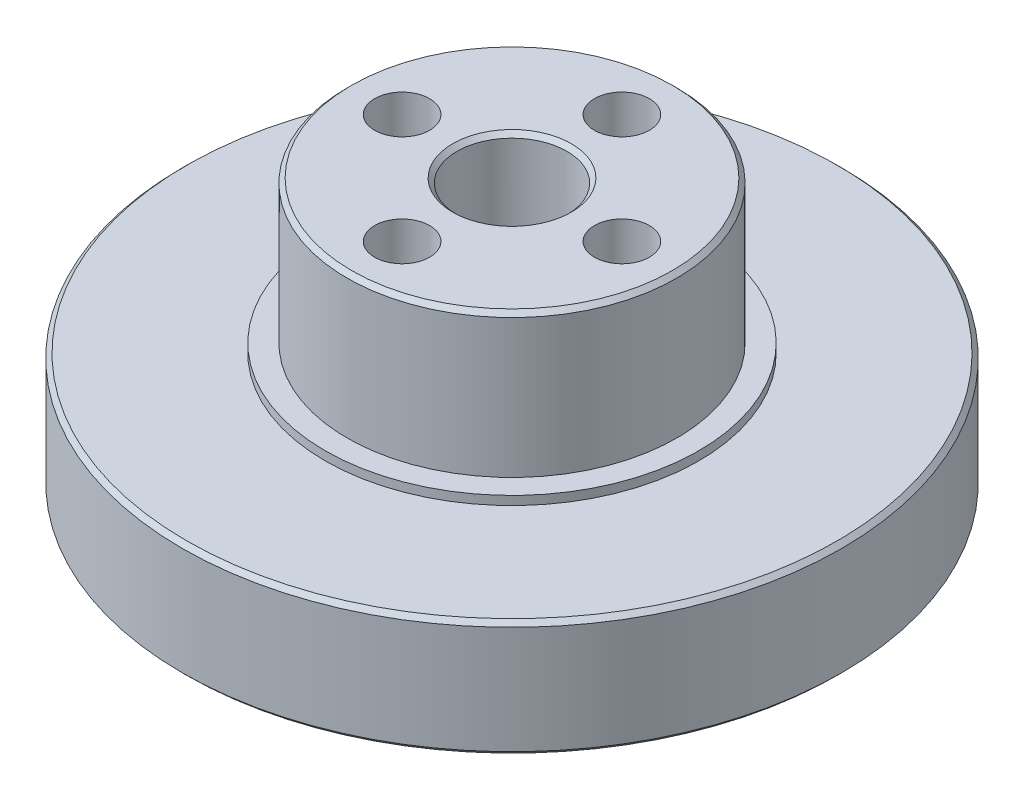
ISO-10303-21;
HEADER;
FILE_DESCRIPTION(('STEP AP214'),'2;1');
FILE_NAME('part.step','',(''),(''),'','','');
FILE_SCHEMA(('AUTOMOTIVE_DESIGN { 1 0 10303 214 1 1 1 1 }'));
ENDSEC;
DATA;
#1=APPLICATION_CONTEXT('core data for automotive mechanical design processes');
#2=APPLICATION_PROTOCOL_DEFINITION('international standard','automotive_design',2000,#1);
#3=PRODUCT_CONTEXT('',#1,'mechanical');
#4=PRODUCT('Part','Part','',(#3));
#5=PRODUCT_RELATED_PRODUCT_CATEGORY('part','',(#4));
#6=PRODUCT_DEFINITION_FORMATION('','',#4);
#7=PRODUCT_DEFINITION_CONTEXT('part definition',#1,'design');
#8=PRODUCT_DEFINITION('design','',#6,#7);
#9=PRODUCT_DEFINITION_SHAPE('','',#8);
#10=(LENGTH_UNIT() NAMED_UNIT(*) SI_UNIT(.MILLI.,.METRE.));
#11=(NAMED_UNIT(*) PLANE_ANGLE_UNIT() SI_UNIT($,.RADIAN.));
#12=(NAMED_UNIT(*) SI_UNIT($,.STERADIAN.) SOLID_ANGLE_UNIT());
#13=UNCERTAINTY_MEASURE_WITH_UNIT(LENGTH_MEASURE(1.E-05),#10,'distance_accuracy_value','');
#14=(GEOMETRIC_REPRESENTATION_CONTEXT(3) GLOBAL_UNCERTAINTY_ASSIGNED_CONTEXT((#13)) GLOBAL_UNIT_ASSIGNED_CONTEXT((#10,
#11,#12)) REPRESENTATION_CONTEXT('',''));
#15=CARTESIAN_POINT('',(0.,0.,0.));
#16=DIRECTION('',(0.,0.,1.));
#17=DIRECTION('',(1.,0.,0.));
#18=AXIS2_PLACEMENT_3D('',#15,#16,#17);
#19=CARTESIAN_POINT('',(0.,5.2,0.));
#20=DIRECTION('',(0.,1.,0.));
#21=DIRECTION('',(0.,0.,1.));
#22=AXIS2_PLACEMENT_3D('',#19,#20,#21);
#23=CYLINDRICAL_SURFACE('',#22,2.5);
#24=CARTESIAN_POINT('',(0.,2.5,0.));
#25=DIRECTION('',(0.,-1.,0.));
#26=DIRECTION('',(0.,0.,-1.));
#27=AXIS2_PLACEMENT_3D('',#24,#25,#26);
#28=CIRCLE('',#27,2.5);
#29=CARTESIAN_POINT('',(0.,2.5,-2.5));
#30=VERTEX_POINT('',#29);
#31=EDGE_CURVE('E10',#30,#30,#28,.T.);
#32=ORIENTED_EDGE('',*,*,#31,.T.);
#33=EDGE_LOOP('',(#32));
#34=FACE_BOUND('',#33,.T.);
#35=CARTESIAN_POINT('',(0.,12.,0.));
#36=DIRECTION('',(0.,1.,0.));
#37=DIRECTION('',(0.,0.,1.));
#38=AXIS2_PLACEMENT_3D('',#35,#36,#37);
#39=CIRCLE('',#38,2.5);
#40=CARTESIAN_POINT('',(0.,12.,2.5));
#41=VERTEX_POINT('',#40);
#42=EDGE_CURVE('E74',#41,#41,#39,.T.);
#43=ORIENTED_EDGE('',*,*,#42,.T.);
#44=EDGE_LOOP('',(#43));
#45=FACE_BOUND('',#44,.T.);
#46=ADVANCED_FACE('F35',(#34,#45),#23,.F.);
#47=CARTESIAN_POINT('',(0.,0.,0.));
#48=DIRECTION('',(0.,1.,0.));
#49=DIRECTION('',(0.,0.,1.));
#50=AXIS2_PLACEMENT_3D('',#47,#48,#49);
#51=PLANE('',#50);
#52=CARTESIAN_POINT('',(0.,0.,0.));
#53=DIRECTION('',(0.,1.,0.));
#54=DIRECTION('',(0.,0.,1.));
#55=AXIS2_PLACEMENT_3D('',#52,#53,#54);
#56=CIRCLE('',#55,6.5);
#57=CARTESIAN_POINT('',(0.,0.,6.5));
#58=VERTEX_POINT('',#57);
#59=EDGE_CURVE('E51',#58,#58,#56,.T.);
#60=ORIENTED_EDGE('',*,*,#59,.T.);
#61=EDGE_LOOP('',(#60));
#62=FACE_BOUND('',#61,.T.);
#63=CARTESIAN_POINT('',(-9.98094277861542,0.,-5.76249999999957));
#64=DIRECTION('',(0.,1.,0.));
#65=DIRECTION('',(0.,0.,1.));
#66=AXIS2_PLACEMENT_3D('',#63,#64,#65);
#67=CIRCLE('',#66,2.06);
#68=CARTESIAN_POINT('',(-9.98094277861542,0.,-7.82249999999957));
#69=VERTEX_POINT('',#68);
#70=EDGE_CURVE('E101',#69,#69,#67,.T.);
#71=ORIENTED_EDGE('',*,*,#70,.T.);
#72=EDGE_LOOP('',(#71));
#73=FACE_BOUND('',#72,.T.);
#74=CARTESIAN_POINT('',(-9.98094277861492,0.,5.76250000000043));
#75=DIRECTION('',(0.,1.,0.));
#76=DIRECTION('',(0.,0.,1.));
#77=AXIS2_PLACEMENT_3D('',#74,#75,#76);
#78=CIRCLE('',#77,2.06);
#79=CARTESIAN_POINT('',(-9.98094277861492,0.,7.82250000000043));
#80=VERTEX_POINT('',#79);
#81=EDGE_CURVE('E104',#80,#80,#78,.T.);
#82=ORIENTED_EDGE('',*,*,#81,.T.);
#83=EDGE_LOOP('',(#82));
#84=FACE_BOUND('',#83,.T.);
#85=CARTESIAN_POINT('',(9.78446387248167E-13,0.,11.525));
#86=DIRECTION('',(0.,1.,0.));
#87=DIRECTION('',(0.,0.,1.));
#88=AXIS2_PLACEMENT_3D('',#85,#86,#87);
#89=CIRCLE('',#88,2.06);
#90=CARTESIAN_POINT('',(9.78446387248167E-13,0.,13.585));
#91=VERTEX_POINT('',#90);
#92=EDGE_CURVE('E107',#91,#91,#89,.T.);
#93=ORIENTED_EDGE('',*,*,#92,.T.);
#94=EDGE_LOOP('',(#93));
#95=FACE_BOUND('',#94,.T.);
#96=CARTESIAN_POINT('',(9.98094277861639,0.,5.76249999999958));
#97=DIRECTION('',(0.,1.,0.));
#98=DIRECTION('',(0.,0.,1.));
#99=AXIS2_PLACEMENT_3D('',#96,#97,#98);
#100=CIRCLE('',#99,2.06);
#101=CARTESIAN_POINT('',(9.98094277861639,0.,7.82249999999957));
#102=VERTEX_POINT('',#101);
#103=EDGE_CURVE('E110',#102,#102,#100,.T.);
#104=ORIENTED_EDGE('',*,*,#103,.T.);
#105=EDGE_LOOP('',(#104));
#106=FACE_BOUND('',#105,.T.);
#107=CARTESIAN_POINT('',(9.9809427786159,0.,-5.76250000000043));
#108=DIRECTION('',(0.,1.,0.));
#109=DIRECTION('',(0.,0.,1.));
#110=AXIS2_PLACEMENT_3D('',#107,#108,#109);
#111=CIRCLE('',#110,2.06);
#112=CARTESIAN_POINT('',(9.9809427786159,0.,-3.70250000000043));
#113=VERTEX_POINT('',#112);
#114=EDGE_CURVE('E113',#113,#113,#111,.T.);
#115=ORIENTED_EDGE('',*,*,#114,.T.);
#116=EDGE_LOOP('',(#115));
#117=FACE_BOUND('',#116,.T.);
#118=CARTESIAN_POINT('',(0.,0.,-11.525));
#119=DIRECTION('',(0.,1.,0.));
#120=DIRECTION('',(0.,0.,1.));
#121=AXIS2_PLACEMENT_3D('',#118,#119,#120);
#122=CIRCLE('',#121,2.06);
#123=CARTESIAN_POINT('',(0.,0.,-9.46500000000001));
#124=VERTEX_POINT('',#123);
#125=EDGE_CURVE('E116',#124,#124,#122,.T.);
#126=ORIENTED_EDGE('',*,*,#125,.T.);
#127=EDGE_LOOP('',(#126));
#128=FACE_BOUND('',#127,.T.);
#129=CARTESIAN_POINT('',(0.,0.,0.));
#130=DIRECTION('',(0.,1.,0.));
#131=DIRECTION('',(0.,0.,1.));
#132=AXIS2_PLACEMENT_3D('',#129,#130,#131);
#133=CIRCLE('',#132,14.8);
#134=CARTESIAN_POINT('',(0.,0.,14.8));
#135=VERTEX_POINT('',#134);
#136=EDGE_CURVE('E119',#135,#135,#133,.F.);
#137=ORIENTED_EDGE('',*,*,#136,.T.);
#138=EDGE_LOOP('',(#137));
#139=FACE_BOUND('',#138,.T.);
#140=ADVANCED_FACE('F208',(#62,#73,#84,#95,#106,#117,#128,#139),#51,.F.);
#141=CARTESIAN_POINT('',(0.,3.7,0.));
#142=DIRECTION('',(0.,-1.,0.));
#143=DIRECTION('',(0.,0.,-1.));
#144=AXIS2_PLACEMENT_3D('',#141,#142,#143);
#145=CYLINDRICAL_SURFACE('',#144,15.);
#146=CARTESIAN_POINT('',(0.,0.200000000000004,0.));
#147=DIRECTION('',(0.,1.,0.));
#148=DIRECTION('',(0.,0.,1.));
#149=AXIS2_PLACEMENT_3D('',#146,#147,#148);
#150=CIRCLE('',#149,15.);
#151=CARTESIAN_POINT('',(0.,0.200000000000004,15.));
#152=VERTEX_POINT('',#151);
#153=EDGE_CURVE('E77',#152,#152,#150,.T.);
#154=ORIENTED_EDGE('',*,*,#153,.T.);
#155=EDGE_LOOP('',(#154));
#156=FACE_BOUND('',#155,.T.);
#157=CARTESIAN_POINT('',(0.,5.1,0.));
#158=DIRECTION('',(0.,1.,0.));
#159=DIRECTION('',(0.,0.,1.));
#160=AXIS2_PLACEMENT_3D('',#157,#158,#159);
#161=CIRCLE('',#160,15.);
#162=CARTESIAN_POINT('',(0.,5.1,15.));
#163=VERTEX_POINT('',#162);
#164=EDGE_CURVE('E80',#163,#163,#161,.F.);
#165=ORIENTED_EDGE('',*,*,#164,.T.);
#166=EDGE_LOOP('',(#165));
#167=FACE_BOUND('',#166,.T.);
#168=ADVANCED_FACE('F213',(#156,#167),#145,.T.);
#169=CARTESIAN_POINT('',(0.,3.7,-11.525));
#170=DIRECTION('',(0.,-1.,0.));
#171=DIRECTION('',(0.,0.,-1.));
#172=AXIS2_PLACEMENT_3D('',#169,#170,#171);
#173=CYLINDRICAL_SURFACE('',#172,1.86);
#174=CARTESIAN_POINT('',(0.,0.199999999999991,-11.525));
#175=DIRECTION('',(0.,1.,0.));
#176=DIRECTION('',(0.,0.,1.));
#177=AXIS2_PLACEMENT_3D('',#174,#175,#176);
#178=CIRCLE('',#177,1.86);
#179=CARTESIAN_POINT('',(0.,0.199999999999991,-9.665));
#180=VERTEX_POINT('',#179);
#181=EDGE_CURVE('E83',#180,#180,#178,.F.);
#182=ORIENTED_EDGE('',*,*,#181,.T.);
#183=EDGE_LOOP('',(#182));
#184=FACE_BOUND('',#183,.T.);
#185=CARTESIAN_POINT('',(0.,3.7,-11.525));
#186=DIRECTION('',(0.,1.,0.));
#187=DIRECTION('',(0.,0.,1.));
#188=AXIS2_PLACEMENT_3D('',#185,#186,#187);
#189=CIRCLE('',#188,1.86);
#190=CARTESIAN_POINT('',(0.,3.7,-9.665));
#191=VERTEX_POINT('',#190);
#192=EDGE_CURVE('E123',#191,#191,#189,.T.);
#193=ORIENTED_EDGE('',*,*,#192,.T.);
#194=EDGE_LOOP('',(#193));
#195=FACE_BOUND('',#194,.T.);
#196=ADVANCED_FACE('F339',(#184,#195),#173,.F.);
#197=CARTESIAN_POINT('',(9.9809427786159,3.7,-5.76250000000043));
#198=DIRECTION('',(0.,-1.,0.));
#199=DIRECTION('',(0.,0.,-1.));
#200=AXIS2_PLACEMENT_3D('',#197,#198,#199);
#201=CYLINDRICAL_SURFACE('',#200,1.86);
#202=CARTESIAN_POINT('',(9.9809427786159,0.199999999999999,-5.76250000000043));
#203=DIRECTION('',(0.,1.,0.));
#204=DIRECTION('',(0.,0.,1.));
#205=AXIS2_PLACEMENT_3D('',#202,#203,#204);
#206=CIRCLE('',#205,1.86);
#207=CARTESIAN_POINT('',(9.9809427786159,0.199999999999999,-3.90250000000043));
#208=VERTEX_POINT('',#207);
#209=EDGE_CURVE('E86',#208,#208,#206,.F.);
#210=ORIENTED_EDGE('',*,*,#209,.T.);
#211=EDGE_LOOP('',(#210));
#212=FACE_BOUND('',#211,.T.);
#213=CARTESIAN_POINT('',(9.9809427786159,3.7,-5.76250000000043));
#214=DIRECTION('',(0.,1.,0.));
#215=DIRECTION('',(0.,0.,1.));
#216=AXIS2_PLACEMENT_3D('',#213,#214,#215);
#217=CIRCLE('',#216,1.86);
#218=CARTESIAN_POINT('',(9.9809427786159,3.7,-3.90250000000043));
#219=VERTEX_POINT('',#218);
#220=EDGE_CURVE('E127',#219,#219,#217,.T.);
#221=ORIENTED_EDGE('',*,*,#220,.T.);
#222=EDGE_LOOP('',(#221));
#223=FACE_BOUND('',#222,.T.);
#224=ADVANCED_FACE('F344',(#212,#223),#201,.F.);
#225=CARTESIAN_POINT('',(9.98094277861639,3.7,5.76249999999958));
#226=DIRECTION('',(0.,-1.,0.));
#227=DIRECTION('',(0.,0.,-1.));
#228=AXIS2_PLACEMENT_3D('',#225,#226,#227);
#229=CYLINDRICAL_SURFACE('',#228,1.86);
#230=CARTESIAN_POINT('',(9.98094277861639,0.199999999999999,5.76249999999958));
#231=DIRECTION('',(0.,1.,0.));
#232=DIRECTION('',(0.,0.,1.));
#233=AXIS2_PLACEMENT_3D('',#230,#231,#232);
#234=CIRCLE('',#233,1.86);
#235=CARTESIAN_POINT('',(9.98094277861639,0.199999999999999,7.62249999999958));
#236=VERTEX_POINT('',#235);
#237=EDGE_CURVE('E89',#236,#236,#234,.F.);
#238=ORIENTED_EDGE('',*,*,#237,.T.);
#239=EDGE_LOOP('',(#238));
#240=FACE_BOUND('',#239,.T.);
#241=CARTESIAN_POINT('',(9.98094277861639,3.7,5.76249999999958));
#242=DIRECTION('',(0.,1.,0.));
#243=DIRECTION('',(0.,0.,1.));
#244=AXIS2_PLACEMENT_3D('',#241,#242,#243);
#245=CIRCLE('',#244,1.86);
#246=CARTESIAN_POINT('',(9.98094277861639,3.7,7.62249999999958));
#247=VERTEX_POINT('',#246);
#248=EDGE_CURVE('E126',#247,#247,#245,.T.);
#249=ORIENTED_EDGE('',*,*,#248,.T.);
#250=EDGE_LOOP('',(#249));
#251=FACE_BOUND('',#250,.T.);
#252=ADVANCED_FACE('F348',(#240,#251),#229,.F.);
#253=CARTESIAN_POINT('',(9.78446387248167E-13,3.7,11.525));
#254=DIRECTION('',(0.,-1.,0.));
#255=DIRECTION('',(0.,0.,-1.));
#256=AXIS2_PLACEMENT_3D('',#253,#254,#255);
#257=CYLINDRICAL_SURFACE('',#256,1.86);
#258=CARTESIAN_POINT('',(9.78446387248167E-13,0.199999999999991,11.525));
#259=DIRECTION('',(0.,1.,0.));
#260=DIRECTION('',(0.,0.,1.));
#261=AXIS2_PLACEMENT_3D('',#258,#259,#260);
#262=CIRCLE('',#261,1.86);
#263=CARTESIAN_POINT('',(9.78446387248167E-13,0.199999999999991,13.385));
#264=VERTEX_POINT('',#263);
#265=EDGE_CURVE('E92',#264,#264,#262,.F.);
#266=ORIENTED_EDGE('',*,*,#265,.T.);
#267=EDGE_LOOP('',(#266));
#268=FACE_BOUND('',#267,.T.);
#269=CARTESIAN_POINT('',(9.78446387248167E-13,3.7,11.525));
#270=DIRECTION('',(0.,1.,0.));
#271=DIRECTION('',(0.,0.,1.));
#272=AXIS2_PLACEMENT_3D('',#269,#270,#271);
#273=CIRCLE('',#272,1.86);
#274=CARTESIAN_POINT('',(9.78446387248167E-13,3.7,13.385));
#275=VERTEX_POINT('',#274);
#276=EDGE_CURVE('E130',#275,#275,#273,.T.);
#277=ORIENTED_EDGE('',*,*,#276,.T.);
#278=EDGE_LOOP('',(#277));
#279=FACE_BOUND('',#278,.T.);
#280=ADVANCED_FACE('F352',(#268,#279),#257,.F.);
#281=CARTESIAN_POINT('',(-9.98094277861492,3.7,5.76250000000043));
#282=DIRECTION('',(0.,-1.,0.));
#283=DIRECTION('',(0.,0.,-1.));
#284=AXIS2_PLACEMENT_3D('',#281,#282,#283);
#285=CYLINDRICAL_SURFACE('',#284,1.86);
#286=CARTESIAN_POINT('',(-9.98094277861492,0.199999999999999,5.76250000000043));
#287=DIRECTION('',(0.,1.,0.));
#288=DIRECTION('',(0.,0.,1.));
#289=AXIS2_PLACEMENT_3D('',#286,#287,#288);
#290=CIRCLE('',#289,1.86);
#291=CARTESIAN_POINT('',(-9.98094277861492,0.199999999999999,7.62250000000043));
#292=VERTEX_POINT('',#291);
#293=EDGE_CURVE('E95',#292,#292,#290,.F.);
#294=ORIENTED_EDGE('',*,*,#293,.T.);
#295=EDGE_LOOP('',(#294));
#296=FACE_BOUND('',#295,.T.);
#297=CARTESIAN_POINT('',(-9.98094277861492,3.7,5.76250000000043));
#298=DIRECTION('',(0.,1.,0.));
#299=DIRECTION('',(0.,0.,1.));
#300=AXIS2_PLACEMENT_3D('',#297,#298,#299);
#301=CIRCLE('',#300,1.86);
#302=CARTESIAN_POINT('',(-9.98094277861492,3.7,7.62250000000043));
#303=VERTEX_POINT('',#302);
#304=EDGE_CURVE('E133',#303,#303,#301,.T.);
#305=ORIENTED_EDGE('',*,*,#304,.T.);
#306=EDGE_LOOP('',(#305));
#307=FACE_BOUND('',#306,.T.);
#308=ADVANCED_FACE('F356',(#296,#307),#285,.F.);
#309=CARTESIAN_POINT('',(-9.98094277861542,3.7,-5.76249999999957));
#310=DIRECTION('',(0.,-1.,0.));
#311=DIRECTION('',(0.,0.,-1.));
#312=AXIS2_PLACEMENT_3D('',#309,#310,#311);
#313=CYLINDRICAL_SURFACE('',#312,1.86);
#314=CARTESIAN_POINT('',(-9.98094277861542,0.2,-5.76249999999957));
#315=DIRECTION('',(0.,1.,0.));
#316=DIRECTION('',(0.,0.,1.));
#317=AXIS2_PLACEMENT_3D('',#314,#315,#316);
#318=CIRCLE('',#317,1.86);
#319=CARTESIAN_POINT('',(-9.98094277861542,0.2,-7.62249999999957));
#320=VERTEX_POINT('',#319);
#321=EDGE_CURVE('E98',#320,#320,#318,.F.);
#322=ORIENTED_EDGE('',*,*,#321,.T.);
#323=EDGE_LOOP('',(#322));
#324=FACE_BOUND('',#323,.T.);
#325=CARTESIAN_POINT('',(-9.98094277861542,3.7,-5.76249999999957));
#326=DIRECTION('',(0.,1.,0.));
#327=DIRECTION('',(0.,0.,1.));
#328=AXIS2_PLACEMENT_3D('',#325,#326,#327);
#329=CIRCLE('',#328,1.86);
#330=CARTESIAN_POINT('',(-9.98094277861542,3.7,-3.90249999999957));
#331=VERTEX_POINT('',#330);
#332=EDGE_CURVE('E136',#331,#331,#329,.T.);
#333=ORIENTED_EDGE('',*,*,#332,.T.);
#334=EDGE_LOOP('',(#333));
#335=FACE_BOUND('',#334,.T.);
#336=ADVANCED_FACE('F360',(#324,#335),#313,.F.);
#337=CARTESIAN_POINT('',(0.,3.7,0.));
#338=DIRECTION('',(0.,1.,0.));
#339=DIRECTION('',(0.,0.,1.));
#340=AXIS2_PLACEMENT_3D('',#337,#338,#339);
#341=PLANE('',#340);
#342=ORIENTED_EDGE('',*,*,#332,.F.);
#343=EDGE_LOOP('',(#342));
#344=FACE_BOUND('',#343,.T.);
#345=ADVANCED_FACE('F364',(#344),#341,.F.);
#346=ORIENTED_EDGE('',*,*,#276,.F.);
#347=EDGE_LOOP('',(#346));
#348=FACE_BOUND('',#347,.T.);
#349=ADVANCED_FACE('F540',(#348),#341,.F.);
#350=ORIENTED_EDGE('',*,*,#220,.F.);
#351=EDGE_LOOP('',(#350));
#352=FACE_BOUND('',#351,.T.);
#353=ADVANCED_FACE('F547',(#352),#341,.F.);
#354=ORIENTED_EDGE('',*,*,#192,.F.);
#355=EDGE_LOOP('',(#354));
#356=FACE_BOUND('',#355,.T.);
#357=ADVANCED_FACE('F554',(#356),#341,.F.);
#358=ORIENTED_EDGE('',*,*,#248,.F.);
#359=EDGE_LOOP('',(#358));
#360=FACE_BOUND('',#359,.T.);
#361=ADVANCED_FACE('F370',(#360),#341,.F.);
#362=ORIENTED_EDGE('',*,*,#304,.F.);
#363=EDGE_LOOP('',(#362));
#364=FACE_BOUND('',#363,.T.);
#365=ADVANCED_FACE('F366',(#364),#341,.F.);
#366=CARTESIAN_POINT('',(0.,5.3,0.));
#367=DIRECTION('',(0.,1.,0.));
#368=DIRECTION('',(0.,0.,1.));
#369=AXIS2_PLACEMENT_3D('',#366,#367,#368);
#370=PLANE('',#369);
#371=CARTESIAN_POINT('',(0.,5.3,0.));
#372=DIRECTION('',(0.,1.,0.));
#373=DIRECTION('',(0.,0.,1.));
#374=AXIS2_PLACEMENT_3D('',#371,#372,#373);
#375=CIRCLE('',#374,14.8);
#376=CARTESIAN_POINT('',(0.,5.3,14.8));
#377=VERTEX_POINT('',#376);
#378=EDGE_CURVE('E62',#377,#377,#375,.T.);
#379=ORIENTED_EDGE('',*,*,#378,.T.);
#380=EDGE_LOOP('',(#379));
#381=FACE_BOUND('',#380,.T.);
#382=CARTESIAN_POINT('',(0.,5.3,0.));
#383=DIRECTION('',(0.,1.,0.));
#384=DIRECTION('',(0.,0.,1.));
#385=AXIS2_PLACEMENT_3D('',#382,#383,#384);
#386=CIRCLE('',#385,8.5);
#387=CARTESIAN_POINT('',(0.,5.3,8.5));
#388=VERTEX_POINT('',#387);
#389=EDGE_CURVE('E139',#388,#388,#386,.T.);
#390=ORIENTED_EDGE('',*,*,#389,.F.);
#391=EDGE_LOOP('',(#390));
#392=FACE_BOUND('',#391,.T.);
#393=ADVANCED_FACE('F369',(#381,#392),#370,.T.);
#394=CARTESIAN_POINT('',(0.,5.7,0.));
#395=DIRECTION('',(0.,-1.,0.));
#396=DIRECTION('',(0.,0.,-1.));
#397=AXIS2_PLACEMENT_3D('',#394,#395,#396);
#398=CYLINDRICAL_SURFACE('',#397,8.5);
#399=CARTESIAN_POINT('',(0.,5.7,0.));
#400=DIRECTION('',(0.,1.,0.));
#401=DIRECTION('',(0.,0.,1.));
#402=AXIS2_PLACEMENT_3D('',#399,#400,#401);
#403=CIRCLE('',#402,8.5);
#404=CARTESIAN_POINT('',(0.,5.7,8.5));
#405=VERTEX_POINT('',#404);
#406=EDGE_CURVE('E142',#405,#405,#403,.T.);
#407=ORIENTED_EDGE('',*,*,#406,.F.);
#408=EDGE_LOOP('',(#407));
#409=FACE_BOUND('',#408,.T.);
#410=ORIENTED_EDGE('',*,*,#389,.T.);
#411=EDGE_LOOP('',(#410));
#412=FACE_BOUND('',#411,.T.);
#413=ADVANCED_FACE('F374',(#409,#412),#398,.T.);
#414=CARTESIAN_POINT('',(0.,5.7,0.));
#415=DIRECTION('',(0.,1.,0.));
#416=DIRECTION('',(0.,0.,1.));
#417=AXIS2_PLACEMENT_3D('',#414,#415,#416);
#418=PLANE('',#417);
#419=CARTESIAN_POINT('',(0.,5.7,0.));
#420=DIRECTION('',(0.,1.,0.));
#421=DIRECTION('',(0.,0.,1.));
#422=AXIS2_PLACEMENT_3D('',#419,#420,#421);
#423=CIRCLE('',#422,7.5);
#424=CARTESIAN_POINT('',(0.,5.7,-7.5));
#425=VERTEX_POINT('',#424);
#426=EDGE_CURVE('E122',#425,#425,#423,.T.);
#427=ORIENTED_EDGE('',*,*,#426,.F.);
#428=EDGE_LOOP('',(#427));
#429=FACE_BOUND('',#428,.T.);
#430=ORIENTED_EDGE('',*,*,#406,.T.);
#431=EDGE_LOOP('',(#430));
#432=FACE_BOUND('',#431,.T.);
#433=ADVANCED_FACE('F378',(#429,#432),#418,.T.);
#434=CARTESIAN_POINT('',(0.,12.2,0.));
#435=DIRECTION('',(0.,-1.,0.));
#436=DIRECTION('',(0.,0.,-1.));
#437=AXIS2_PLACEMENT_3D('',#434,#435,#436);
#438=CYLINDRICAL_SURFACE('',#437,7.5);
#439=CARTESIAN_POINT('',(0.,12.,0.));
#440=DIRECTION('',(0.,1.,0.));
#441=DIRECTION('',(0.,0.,1.));
#442=AXIS2_PLACEMENT_3D('',#439,#440,#441);
#443=CIRCLE('',#442,7.5);
#444=CARTESIAN_POINT('',(0.,12.,-7.5));
#445=VERTEX_POINT('',#444);
#446=EDGE_CURVE('E65',#445,#445,#443,.F.);
#447=CARTESIAN_POINT('',(0.,12.,-7.5));
#448=CARTESIAN_POINT('',(0.,11.934375,-7.5));
#449=CARTESIAN_POINT('',(0.,11.86875,-7.5));
#450=CARTESIAN_POINT('',(0.,11.7375,-7.5));
#451=CARTESIAN_POINT('',(0.,11.671875,-7.5));
#452=CARTESIAN_POINT('',(0.,11.540625,-7.5));
#453=CARTESIAN_POINT('',(0.,11.475,-7.5));
#454=CARTESIAN_POINT('',(0.,11.34375,-7.5));
#455=CARTESIAN_POINT('',(0.,11.278125,-7.5));
#456=CARTESIAN_POINT('',(0.,11.146875,-7.5));
#457=CARTESIAN_POINT('',(0.,11.08125,-7.5));
#458=CARTESIAN_POINT('',(0.,10.95,-7.5));
#459=CARTESIAN_POINT('',(0.,10.884375,-7.5));
#460=CARTESIAN_POINT('',(0.,10.753125,-7.5));
#461=CARTESIAN_POINT('',(0.,10.6875,-7.5));
#462=CARTESIAN_POINT('',(0.,10.55625,-7.5));
#463=CARTESIAN_POINT('',(0.,10.490625,-7.5));
#464=CARTESIAN_POINT('',(0.,10.359375,-7.5));
#465=CARTESIAN_POINT('',(0.,10.29375,-7.5));
#466=CARTESIAN_POINT('',(0.,10.1625,-7.5));
#467=CARTESIAN_POINT('',(0.,10.096875,-7.5));
#468=CARTESIAN_POINT('',(0.,9.96562500000002,-7.5));
#469=CARTESIAN_POINT('',(0.,9.90000000000002,-7.5));
#470=CARTESIAN_POINT('',(0.,9.76875000000002,-7.5));
#471=CARTESIAN_POINT('',(0.,9.70312500000002,-7.5));
#472=CARTESIAN_POINT('',(0.,9.57187500000002,-7.5));
#473=CARTESIAN_POINT('',(0.,9.50625000000002,-7.5));
#474=CARTESIAN_POINT('',(0.,9.37500000000002,-7.5));
#475=CARTESIAN_POINT('',(0.,9.30937500000002,-7.5));
#476=CARTESIAN_POINT('',(0.,9.17812500000001,-7.5));
#477=CARTESIAN_POINT('',(0.,9.11250000000001,-7.5));
#478=CARTESIAN_POINT('',(0.,8.98125000000001,-7.5));
#479=CARTESIAN_POINT('',(0.,8.91562500000001,-7.5));
#480=CARTESIAN_POINT('',(0.,8.78437500000001,-7.5));
#481=CARTESIAN_POINT('',(0.,8.71875000000001,-7.5));
#482=CARTESIAN_POINT('',(0.,8.58750000000001,-7.5));
#483=CARTESIAN_POINT('',(0.,8.52187500000001,-7.5));
#484=CARTESIAN_POINT('',(0.,8.39062500000001,-7.5));
#485=CARTESIAN_POINT('',(0.,8.32500000000001,-7.5));
#486=CARTESIAN_POINT('',(0.,8.19375000000001,-7.5));
#487=CARTESIAN_POINT('',(0.,8.12812500000001,-7.5));
#488=CARTESIAN_POINT('',(0.,7.99687500000001,-7.5));
#489=CARTESIAN_POINT('',(0.,7.93125000000001,-7.5));
#490=CARTESIAN_POINT('',(0.,7.80000000000001,-7.5));
#491=CARTESIAN_POINT('',(0.,7.73437500000001,-7.5));
#492=CARTESIAN_POINT('',(0.,7.60312500000001,-7.5));
#493=CARTESIAN_POINT('',(0.,7.53750000000001,-7.5));
#494=CARTESIAN_POINT('',(0.,7.40625000000001,-7.5));
#495=CARTESIAN_POINT('',(0.,7.34062500000001,-7.5));
#496=CARTESIAN_POINT('',(0.,7.20937500000001,-7.5));
#497=CARTESIAN_POINT('',(0.,7.14375000000001,-7.5));
#498=CARTESIAN_POINT('',(0.,7.0125,-7.5));
#499=CARTESIAN_POINT('',(0.,6.946875,-7.5));
#500=CARTESIAN_POINT('',(0.,6.815625,-7.5));
#501=CARTESIAN_POINT('',(0.,6.75,-7.5));
#502=CARTESIAN_POINT('',(0.,6.61875,-7.5));
#503=CARTESIAN_POINT('',(0.,6.553125,-7.5));
#504=CARTESIAN_POINT('',(0.,6.421875,-7.5));
#505=CARTESIAN_POINT('',(0.,6.35625,-7.5));
#506=CARTESIAN_POINT('',(0.,6.225,-7.5));
#507=CARTESIAN_POINT('',(0.,6.159375,-7.5));
#508=CARTESIAN_POINT('',(0.,6.028125,-7.5));
#509=CARTESIAN_POINT('',(0.,5.9625,-7.5));
#510=CARTESIAN_POINT('',(0.,5.83125,-7.5));
#511=CARTESIAN_POINT('',(0.,5.765625,-7.5));
#512=CARTESIAN_POINT('',(0.,5.7,-7.5));
#513=B_SPLINE_CURVE_WITH_KNOTS('',3,(#447,#448,#449,#450,#451,#452,#453,#454,#455,#456,#457,
#458,#459,#460,#461,#462,#463,#464,#465,#466,#467,#468,#469,#470,#471,#472,#473,#474,#475,#476,
#477,#478,#479,#480,#481,#482,#483,#484,#485,#486,#487,#488,#489,#490,#491,#492,#493,#494,#495,
#496,#497,#498,#499,#500,#501,#502,#503,#504,#505,#506,#507,#508,#509,#510,#511,#512),
.UNSPECIFIED.,.F.,.F.,(4,2,2,2,2,2,2,2,2,2,2,2,2,2,2,2,2,2,2,2,2,2,2,2,2,2,2,2,2,2,2,2,4),(0.,
0.196875000000001,0.39375,0.590625000000003,0.787500000000002,0.984375000000004,1.18125,
1.37812500000001,1.57500000000001,1.77187500000001,1.96875000000001,2.16562500000001,
2.36250000000001,2.55937500000001,2.75625000000001,2.95312500000001,3.15000000000001,
3.34687500000001,3.54375000000001,3.74062500000002,3.93750000000002,4.13437500000002,
4.33125000000002,4.52812500000002,4.72500000000002,4.92187500000002,5.11875000000002,
5.31562500000002,5.51250000000002,5.70937500000002,5.90625000000002,6.10312500000003,
6.30000000000003),.UNSPECIFIED.);
#514=EDGE_CURVE('BSEAM187',#445,#425,#513,.T.);
#515=ORIENTED_EDGE('',*,*,#446,.T.);
#516=ORIENTED_EDGE('',*,*,#426,.T.);
#517=ORIENTED_EDGE('',*,*,#514,.T.);
#518=ORIENTED_EDGE('',*,*,#514,.F.);
#519=EDGE_LOOP('',(#515,#517,#516,#518));
#520=FACE_BOUND('',#519,.T.);
#521=ADVANCED_FACE('F187',(#520),#438,.T.);
#522=CARTESIAN_POINT('',(0.,12.2,0.));
#523=DIRECTION('',(0.,1.,0.));
#524=DIRECTION('',(0.,0.,1.));
#525=AXIS2_PLACEMENT_3D('',#522,#523,#524);
#526=PLANE('',#525);
#527=CARTESIAN_POINT('',(0.,12.2,0.));
#528=DIRECTION('',(0.,1.,0.));
#529=DIRECTION('',(0.,0.,1.));
#530=AXIS2_PLACEMENT_3D('',#527,#528,#529);
#531=CIRCLE('',#530,2.7);
#532=CARTESIAN_POINT('',(0.,12.2,2.7));
#533=VERTEX_POINT('',#532);
#534=EDGE_CURVE('E68',#533,#533,#531,.F.);
#535=ORIENTED_EDGE('',*,*,#534,.T.);
#536=EDGE_LOOP('',(#535));
#537=FACE_BOUND('',#536,.T.);
#538=CARTESIAN_POINT('',(0.,12.2,0.));
#539=DIRECTION('',(0.,1.,0.));
#540=DIRECTION('',(0.,0.,1.));
#541=AXIS2_PLACEMENT_3D('',#538,#539,#540);
#542=CIRCLE('',#541,7.30000000000003);
#543=CARTESIAN_POINT('',(0.,12.2,7.30000000000003));
#544=VERTEX_POINT('',#543);
#545=EDGE_CURVE('E71',#544,#544,#542,.T.);
#546=ORIENTED_EDGE('',*,*,#545,.T.);
#547=EDGE_LOOP('',(#546));
#548=FACE_BOUND('',#547,.T.);
#549=CARTESIAN_POINT('',(0.,12.2,-5.));
#550=DIRECTION('',(0.,1.,0.));
#551=DIRECTION('',(0.,0.,1.));
#552=AXIS2_PLACEMENT_3D('',#549,#550,#551);
#553=CIRCLE('',#552,1.25);
#554=CARTESIAN_POINT('',(0.,12.2,-3.75));
#555=VERTEX_POINT('',#554);
#556=EDGE_CURVE('E157',#555,#555,#553,.T.);
#557=ORIENTED_EDGE('',*,*,#556,.F.);
#558=EDGE_LOOP('',(#557));
#559=FACE_BOUND('',#558,.T.);
#560=CARTESIAN_POINT('',(-4.99999999999986,12.2,1.41802385452233E-13));
#561=DIRECTION('',(0.,1.,0.));
#562=DIRECTION('',(0.,0.,1.));
#563=AXIS2_PLACEMENT_3D('',#560,#561,#562);
#564=CIRCLE('',#563,1.25);
#565=CARTESIAN_POINT('',(-4.99999999999986,12.2,1.25000000000014));
#566=VERTEX_POINT('',#565);
#567=EDGE_CURVE('E158',#566,#566,#564,.T.);
#568=ORIENTED_EDGE('',*,*,#567,.F.);
#569=EDGE_LOOP('',(#568));
#570=FACE_BOUND('',#569,.T.);
#571=CARTESIAN_POINT('',(2.82380124105319E-13,12.2,5.));
#572=DIRECTION('',(0.,1.,0.));
#573=DIRECTION('',(0.,0.,1.));
#574=AXIS2_PLACEMENT_3D('',#571,#572,#573);
#575=CIRCLE('',#574,1.25);
#576=CARTESIAN_POINT('',(2.82380124105319E-13,12.2,6.25));
#577=VERTEX_POINT('',#576);
#578=EDGE_CURVE('E164',#577,#577,#575,.T.);
#579=ORIENTED_EDGE('',*,*,#578,.F.);
#580=EDGE_LOOP('',(#579));
#581=FACE_BOUND('',#580,.T.);
#582=CARTESIAN_POINT('',(5.00000000000014,12.2,-1.4119006205266E-13));
#583=DIRECTION('',(0.,1.,0.));
#584=DIRECTION('',(0.,0.,1.));
#585=AXIS2_PLACEMENT_3D('',#582,#583,#584);
#586=CIRCLE('',#585,1.25);
#587=CARTESIAN_POINT('',(5.00000000000014,12.2,1.24999999999986));
#588=VERTEX_POINT('',#587);
#589=EDGE_CURVE('E150',#588,#588,#586,.T.);
#590=ORIENTED_EDGE('',*,*,#589,.F.);
#591=EDGE_LOOP('',(#590));
#592=FACE_BOUND('',#591,.T.);
#593=ADVANCED_FACE('F183',(#537,#548,#559,#570,#581,#592),#526,.T.);
#594=CARTESIAN_POINT('',(5.00000000000014,5.2,-1.4119006205266E-13));
#595=DIRECTION('',(0.,1.,0.));
#596=DIRECTION('',(0.,0.,1.));
#597=AXIS2_PLACEMENT_3D('',#594,#595,#596);
#598=CYLINDRICAL_SURFACE('',#597,1.25);
#599=CARTESIAN_POINT('',(5.00000000000014,5.2,-1.4119006205266E-13));
#600=DIRECTION('',(0.,1.,0.));
#601=DIRECTION('',(0.,0.,1.));
#602=AXIS2_PLACEMENT_3D('',#599,#600,#601);
#603=CIRCLE('',#602,1.25);
#604=CARTESIAN_POINT('',(5.00000000000014,5.2,1.24999999999986));
#605=VERTEX_POINT('',#604);
#606=EDGE_CURVE('E153',#605,#605,#603,.T.);
#607=ORIENTED_EDGE('',*,*,#606,.F.);
#608=EDGE_LOOP('',(#607));
#609=FACE_BOUND('',#608,.T.);
#610=ORIENTED_EDGE('',*,*,#589,.T.);
#611=EDGE_LOOP('',(#610));
#612=FACE_BOUND('',#611,.T.);
#613=ADVANCED_FACE('F186',(#609,#612),#598,.F.);
#614=CARTESIAN_POINT('',(5.00000000000014,5.2,-1.4119006205266E-13));
#615=DIRECTION('',(0.,1.,0.));
#616=DIRECTION('',(0.,0.,1.));
#617=AXIS2_PLACEMENT_3D('',#614,#615,#616);
#618=PLANE('',#617);
#619=ORIENTED_EDGE('',*,*,#606,.T.);
#620=EDGE_LOOP('',(#619));
#621=FACE_BOUND('',#620,.T.);
#622=ADVANCED_FACE('F197',(#621),#618,.T.);
#623=CARTESIAN_POINT('',(2.82380124105319E-13,5.2,5.));
#624=DIRECTION('',(0.,1.,0.));
#625=DIRECTION('',(0.,0.,1.));
#626=AXIS2_PLACEMENT_3D('',#623,#624,#625);
#627=CYLINDRICAL_SURFACE('',#626,1.25);
#628=CARTESIAN_POINT('',(2.82380124105319E-13,5.2,5.));
#629=DIRECTION('',(0.,1.,0.));
#630=DIRECTION('',(0.,0.,1.));
#631=AXIS2_PLACEMENT_3D('',#628,#629,#630);
#632=CIRCLE('',#631,1.25);
#633=CARTESIAN_POINT('',(2.82380124105319E-13,5.2,6.25));
#634=VERTEX_POINT('',#633);
#635=EDGE_CURVE('E154',#634,#634,#632,.T.);
#636=ORIENTED_EDGE('',*,*,#635,.F.);
#637=EDGE_LOOP('',(#636));
#638=FACE_BOUND('',#637,.T.);
#639=ORIENTED_EDGE('',*,*,#578,.T.);
#640=EDGE_LOOP('',(#639));
#641=FACE_BOUND('',#640,.T.);
#642=ADVANCED_FACE('F203',(#638,#641),#627,.F.);
#643=CARTESIAN_POINT('',(2.82380124105319E-13,5.2,5.));
#644=DIRECTION('',(0.,1.,0.));
#645=DIRECTION('',(0.,0.,1.));
#646=AXIS2_PLACEMENT_3D('',#643,#644,#645);
#647=PLANE('',#646);
#648=ORIENTED_EDGE('',*,*,#635,.T.);
#649=EDGE_LOOP('',(#648));
#650=FACE_BOUND('',#649,.T.);
#651=ADVANCED_FACE('F221',(#650),#647,.T.);
#652=CARTESIAN_POINT('',(-4.99999999999986,5.2,1.41802385452233E-13));
#653=DIRECTION('',(0.,1.,0.));
#654=DIRECTION('',(0.,0.,1.));
#655=AXIS2_PLACEMENT_3D('',#652,#653,#654);
#656=CYLINDRICAL_SURFACE('',#655,1.25);
#657=CARTESIAN_POINT('',(-4.99999999999986,5.2,1.41802385452233E-13));
#658=DIRECTION('',(0.,1.,0.));
#659=DIRECTION('',(0.,0.,1.));
#660=AXIS2_PLACEMENT_3D('',#657,#658,#659);
#661=CIRCLE('',#660,1.25);
#662=CARTESIAN_POINT('',(-4.99999999999986,5.2,1.25000000000014));
#663=VERTEX_POINT('',#662);
#664=EDGE_CURVE('E161',#663,#663,#661,.T.);
#665=ORIENTED_EDGE('',*,*,#664,.F.);
#666=EDGE_LOOP('',(#665));
#667=FACE_BOUND('',#666,.T.);
#668=ORIENTED_EDGE('',*,*,#567,.T.);
#669=EDGE_LOOP('',(#668));
#670=FACE_BOUND('',#669,.T.);
#671=ADVANCED_FACE('F218',(#667,#670),#656,.F.);
#672=CARTESIAN_POINT('',(-4.99999999999986,5.2,1.41802385452233E-13));
#673=DIRECTION('',(0.,1.,0.));
#674=DIRECTION('',(0.,0.,1.));
#675=AXIS2_PLACEMENT_3D('',#672,#673,#674);
#676=PLANE('',#675);
#677=ORIENTED_EDGE('',*,*,#664,.T.);
#678=EDGE_LOOP('',(#677));
#679=FACE_BOUND('',#678,.T.);
#680=ADVANCED_FACE('F179',(#679),#676,.T.);
#681=CARTESIAN_POINT('',(0.,5.2,-5.));
#682=DIRECTION('',(0.,1.,0.));
#683=DIRECTION('',(0.,0.,1.));
#684=AXIS2_PLACEMENT_3D('',#681,#682,#683);
#685=CYLINDRICAL_SURFACE('',#684,1.25);
#686=CARTESIAN_POINT('',(0.,5.2,-5.));
#687=DIRECTION('',(0.,1.,0.));
#688=DIRECTION('',(0.,0.,1.));
#689=AXIS2_PLACEMENT_3D('',#686,#687,#688);
#690=CIRCLE('',#689,1.25);
#691=CARTESIAN_POINT('',(0.,5.2,-3.75));
#692=VERTEX_POINT('',#691);
#693=EDGE_CURVE('E147',#692,#692,#690,.T.);
#694=ORIENTED_EDGE('',*,*,#693,.F.);
#695=EDGE_LOOP('',(#694));
#696=FACE_BOUND('',#695,.T.);
#697=ORIENTED_EDGE('',*,*,#556,.T.);
#698=EDGE_LOOP('',(#697));
#699=FACE_BOUND('',#698,.T.);
#700=ADVANCED_FACE('F176',(#696,#699),#685,.F.);
#701=CARTESIAN_POINT('',(0.,5.2,-5.));
#702=DIRECTION('',(0.,1.,0.));
#703=DIRECTION('',(0.,0.,1.));
#704=AXIS2_PLACEMENT_3D('',#701,#702,#703);
#705=PLANE('',#704);
#706=ORIENTED_EDGE('',*,*,#693,.T.);
#707=EDGE_LOOP('',(#706));
#708=FACE_BOUND('',#707,.T.);
#709=ADVANCED_FACE('F174',(#708),#705,.T.);
#710=CARTESIAN_POINT('',(-9.98094277861542,0.,-5.76249999999957));
#711=DIRECTION('',(0.,-1.,0.));
#712=DIRECTION('',(0.,0.,-1.));
#713=AXIS2_PLACEMENT_3D('',#710,#711,#712);
#714=CONICAL_SURFACE('',#713,2.06,0.785398163397451);
#715=CARTESIAN_POINT('',(-9.98094277861542,0.2,-7.62249999999957));
#716=CARTESIAN_POINT('',(-9.98094277861542,0.197916666666666,-7.6245833333329));
#717=CARTESIAN_POINT('',(-9.98094277861542,0.195833333333333,-7.62666666666624));
#718=CARTESIAN_POINT('',(-9.98094277861542,0.191666666666666,-7.6308333333329));
#719=CARTESIAN_POINT('',(-9.98094277861542,0.189583333333333,-7.63291666666624));
#720=CARTESIAN_POINT('',(-9.98094277861542,0.185416666666666,-7.6370833333329));
#721=CARTESIAN_POINT('',(-9.98094277861542,0.183333333333333,-7.63916666666624));
#722=CARTESIAN_POINT('',(-9.98094277861542,0.179166666666666,-7.6433333333329));
#723=CARTESIAN_POINT('',(-9.98094277861542,0.177083333333333,-7.64541666666624));
#724=CARTESIAN_POINT('',(-9.98094277861542,0.172916666666666,-7.6495833333329));
#725=CARTESIAN_POINT('',(-9.98094277861542,0.170833333333333,-7.65166666666624));
#726=CARTESIAN_POINT('',(-9.98094277861542,0.166666666666666,-7.6558333333329));
#727=CARTESIAN_POINT('',(-9.98094277861542,0.164583333333333,-7.65791666666624));
#728=CARTESIAN_POINT('',(-9.98094277861542,0.160416666666666,-7.6620833333329));
#729=CARTESIAN_POINT('',(-9.98094277861542,0.158333333333333,-7.66416666666624));
#730=CARTESIAN_POINT('',(-9.98094277861542,0.154166666666666,-7.6683333333329));
#731=CARTESIAN_POINT('',(-9.98094277861542,0.152083333333333,-7.67041666666624));
#732=CARTESIAN_POINT('',(-9.98094277861542,0.147916666666666,-7.6745833333329));
#733=CARTESIAN_POINT('',(-9.98094277861542,0.145833333333333,-7.67666666666624));
#734=CARTESIAN_POINT('',(-9.98094277861542,0.141666666666666,-7.6808333333329));
#735=CARTESIAN_POINT('',(-9.98094277861542,0.139583333333333,-7.68291666666624));
#736=CARTESIAN_POINT('',(-9.98094277861542,0.135416666666666,-7.6870833333329));
#737=CARTESIAN_POINT('',(-9.98094277861542,0.133333333333333,-7.68916666666624));
#738=CARTESIAN_POINT('',(-9.98094277861542,0.129166666666666,-7.6933333333329));
#739=CARTESIAN_POINT('',(-9.98094277861542,0.127083333333333,-7.69541666666624));
#740=CARTESIAN_POINT('',(-9.98094277861542,0.122916666666666,-7.6995833333329));
#741=CARTESIAN_POINT('',(-9.98094277861542,0.120833333333333,-7.70166666666624));
#742=CARTESIAN_POINT('',(-9.98094277861542,0.116666666666666,-7.7058333333329));
#743=CARTESIAN_POINT('',(-9.98094277861542,0.114583333333333,-7.70791666666624));
#744=CARTESIAN_POINT('',(-9.98094277861542,0.110416666666666,-7.7120833333329));
#745=CARTESIAN_POINT('',(-9.98094277861542,0.108333333333333,-7.71416666666624));
#746=CARTESIAN_POINT('',(-9.98094277861542,0.104166666666666,-7.7183333333329));
#747=CARTESIAN_POINT('',(-9.98094277861542,0.102083333333333,-7.72041666666624));
#748=CARTESIAN_POINT('',(-9.98094277861542,0.0979166666666665,-7.7245833333329));
#749=CARTESIAN_POINT('',(-9.98094277861542,0.0958333333333333,-7.72666666666624));
#750=CARTESIAN_POINT('',(-9.98094277861542,0.0916666666666665,-7.7308333333329));
#751=CARTESIAN_POINT('',(-9.98094277861542,0.089583333333333,-7.73291666666624));
#752=CARTESIAN_POINT('',(-9.98094277861542,0.0854166666666664,-7.7370833333329));
#753=CARTESIAN_POINT('',(-9.98094277861542,0.0833333333333333,-7.73916666666624));
#754=CARTESIAN_POINT('',(-9.98094277861542,0.0791666666666667,-7.7433333333329));
#755=CARTESIAN_POINT('',(-9.98094277861542,0.0770833333333332,-7.74541666666624));
#756=CARTESIAN_POINT('',(-9.98094277861542,0.0729166666666664,-7.7495833333329));
#757=CARTESIAN_POINT('',(-9.98094277861542,0.0708333333333331,-7.75166666666624));
#758=CARTESIAN_POINT('',(-9.98094277861542,0.0666666666666666,-7.7558333333329));
#759=CARTESIAN_POINT('',(-9.98094277861542,0.0645833333333333,-7.75791666666624));
#760=CARTESIAN_POINT('',(-9.98094277861542,0.0604166666666666,-7.7620833333329));
#761=CARTESIAN_POINT('',(-9.98094277861542,0.0583333333333331,-7.76416666666624));
#762=CARTESIAN_POINT('',(-9.98094277861542,0.0541666666666664,-7.7683333333329));
#763=CARTESIAN_POINT('',(-9.98094277861542,0.0520833333333334,-7.77041666666624));
#764=CARTESIAN_POINT('',(-9.98094277861542,0.0479166666666667,-7.7745833333329));
#765=CARTESIAN_POINT('',(-9.98094277861542,0.0458333333333332,-7.77666666666624));
#766=CARTESIAN_POINT('',(-9.98094277861542,0.0416666666666665,-7.7808333333329));
#767=CARTESIAN_POINT('',(-9.98094277861542,0.0395833333333332,-7.78291666666624));
#768=CARTESIAN_POINT('',(-9.98094277861542,0.0354166666666667,-7.7870833333329));
#769=CARTESIAN_POINT('',(-9.98094277861542,0.0333333333333334,-7.78916666666624));
#770=CARTESIAN_POINT('',(-9.98094277861542,0.0291666666666666,-7.7933333333329));
#771=CARTESIAN_POINT('',(-9.98094277861542,0.0270833333333331,-7.79541666666624));
#772=CARTESIAN_POINT('',(-9.98094277861542,0.0229166666666665,-7.7995833333329));
#773=CARTESIAN_POINT('',(-9.98094277861542,0.0208333333333334,-7.80166666666624));
#774=CARTESIAN_POINT('',(-9.98094277861542,0.0166666666666668,-7.8058333333329));
#775=CARTESIAN_POINT('',(-9.98094277861542,0.0145833333333332,-7.80791666666624));
#776=CARTESIAN_POINT('',(-9.98094277861542,0.0104166666666665,-7.8120833333329));
#777=CARTESIAN_POINT('',(-9.98094277861542,0.0083333333333333,-7.81416666666624));
#778=CARTESIAN_POINT('',(-9.98094277861542,0.00416666666666697,-7.8183333333329));
#779=CARTESIAN_POINT('',(-9.98094277861542,0.0020833333333338,-7.82041666666624));
#780=CARTESIAN_POINT('',(-9.98094277861542,0.,-7.82249999999957));
#781=B_SPLINE_CURVE_WITH_KNOTS('',3,(#715,#716,#717,#718,#719,#720,#721,#722,#723,#724,#725,
#726,#727,#728,#729,#730,#731,#732,#733,#734,#735,#736,#737,#738,#739,#740,#741,#742,#743,#744,
#745,#746,#747,#748,#749,#750,#751,#752,#753,#754,#755,#756,#757,#758,#759,#760,#761,#762,#763,
#764,#765,#766,#767,#768,#769,#770,#771,#772,#773,#774,#775,#776,#777,#778,#779,#780),
.UNSPECIFIED.,.F.,.F.,(4,2,2,2,2,2,2,2,2,2,2,2,2,2,2,2,2,2,2,2,2,2,2,2,2,2,2,2,2,2,2,2,4),(0.,
0.00883883476483135,0.0176776695296639,0.0265165042944953,0.0353553390593272,0.0441941738241592,
0.0530330085889912,0.0618718433538231,0.0707106781186545,0.0795495128834865,0.0883883476483184,
0.0972271824131504,0.106066017177982,0.114904851942814,0.123743686707646,0.132582521472478,
0.14142135623731,0.150260191002142,0.159099025766973,0.167937860531805,0.176776695296637,
0.185615530061469,0.194454364826301,0.203293199591132,0.212132034355965,0.220970869120796,
0.229809703885628,0.23864853865046,0.247487373415291,0.256326208180124,0.265165042944955,
0.274003877709788,0.282842712474619),.UNSPECIFIED.);
#782=EDGE_CURVE('BSEAM234',#320,#69,#781,.T.);
#783=ORIENTED_EDGE('',*,*,#321,.F.);
#784=ORIENTED_EDGE('',*,*,#70,.F.);
#785=ORIENTED_EDGE('',*,*,#782,.T.);
#786=ORIENTED_EDGE('',*,*,#782,.F.);
#787=EDGE_LOOP('',(#783,#785,#784,#786));
#788=FACE_BOUND('',#787,.T.);
#789=ADVANCED_FACE('F234',(#788),#714,.F.);
#790=CARTESIAN_POINT('',(-9.98094277861492,0.,5.76250000000043));
#791=DIRECTION('',(0.,-1.,0.));
#792=DIRECTION('',(0.,0.,-1.));
#793=AXIS2_PLACEMENT_3D('',#790,#791,#792);
#794=CONICAL_SURFACE('',#793,2.06,0.785398163397447);
#795=ORIENTED_EDGE('',*,*,#293,.F.);
#796=EDGE_LOOP('',(#795));
#797=FACE_BOUND('',#796,.T.);
#798=ORIENTED_EDGE('',*,*,#81,.F.);
#799=EDGE_LOOP('',(#798));
#800=FACE_BOUND('',#799,.T.);
#801=ADVANCED_FACE('F325',(#797,#800),#794,.F.);
#802=CARTESIAN_POINT('',(9.78446387248167E-13,0.,11.525));
#803=DIRECTION('',(0.,-1.,0.));
#804=DIRECTION('',(0.,0.,-1.));
#805=AXIS2_PLACEMENT_3D('',#802,#803,#804);
#806=CONICAL_SURFACE('',#805,2.06,0.785398163397459);
#807=ORIENTED_EDGE('',*,*,#265,.F.);
#808=EDGE_LOOP('',(#807));
#809=FACE_BOUND('',#808,.T.);
#810=ORIENTED_EDGE('',*,*,#92,.F.);
#811=EDGE_LOOP('',(#810));
#812=FACE_BOUND('',#811,.T.);
#813=ADVANCED_FACE('F318',(#809,#812),#806,.F.);
#814=CARTESIAN_POINT('',(9.98094277861639,0.,5.76249999999958));
#815=DIRECTION('',(0.,-1.,0.));
#816=DIRECTION('',(0.,0.,-1.));
#817=AXIS2_PLACEMENT_3D('',#814,#815,#816);
#818=CONICAL_SURFACE('',#817,2.06,0.785398163397447);
#819=ORIENTED_EDGE('',*,*,#237,.F.);
#820=EDGE_LOOP('',(#819));
#821=FACE_BOUND('',#820,.T.);
#822=ORIENTED_EDGE('',*,*,#103,.F.);
#823=EDGE_LOOP('',(#822));
#824=FACE_BOUND('',#823,.T.);
#825=ADVANCED_FACE('F311',(#821,#824),#818,.F.);
#826=CARTESIAN_POINT('',(9.9809427786159,0.,-5.76250000000043));
#827=DIRECTION('',(0.,-1.,0.));
#828=DIRECTION('',(0.,0.,-1.));
#829=AXIS2_PLACEMENT_3D('',#826,#827,#828);
#830=CONICAL_SURFACE('',#829,2.06,0.785398163397447);
#831=ORIENTED_EDGE('',*,*,#209,.F.);
#832=EDGE_LOOP('',(#831));
#833=FACE_BOUND('',#832,.T.);
#834=ORIENTED_EDGE('',*,*,#114,.F.);
#835=EDGE_LOOP('',(#834));
#836=FACE_BOUND('',#835,.T.);
#837=ADVANCED_FACE('F304',(#833,#836),#830,.F.);
#838=CARTESIAN_POINT('',(0.,0.,-11.525));
#839=DIRECTION('',(0.,-1.,0.));
#840=DIRECTION('',(0.,0.,-1.));
#841=AXIS2_PLACEMENT_3D('',#838,#839,#840);
#842=CONICAL_SURFACE('',#841,2.06,0.785398163397459);
#843=ORIENTED_EDGE('',*,*,#181,.F.);
#844=EDGE_LOOP('',(#843));
#845=FACE_BOUND('',#844,.T.);
#846=ORIENTED_EDGE('',*,*,#125,.F.);
#847=EDGE_LOOP('',(#846));
#848=FACE_BOUND('',#847,.T.);
#849=ADVANCED_FACE('F297',(#845,#848),#842,.F.);
#850=CARTESIAN_POINT('',(0.,0.200000000000004,0.));
#851=DIRECTION('',(0.,1.,0.));
#852=DIRECTION('',(0.,0.,1.));
#853=AXIS2_PLACEMENT_3D('',#850,#851,#852);
#854=CONICAL_SURFACE('',#853,15.,0.785398163397448);
#855=ORIENTED_EDGE('',*,*,#136,.F.);
#856=EDGE_LOOP('',(#855));
#857=FACE_BOUND('',#856,.T.);
#858=ORIENTED_EDGE('',*,*,#153,.F.);
#859=EDGE_LOOP('',(#858));
#860=FACE_BOUND('',#859,.T.);
#861=ADVANCED_FACE('F290',(#857,#860),#854,.T.);
#862=CARTESIAN_POINT('',(0.,12.,0.));
#863=DIRECTION('',(0.,1.,0.));
#864=DIRECTION('',(0.,0.,1.));
#865=AXIS2_PLACEMENT_3D('',#862,#863,#864);
#866=CONICAL_SURFACE('',#865,2.5,0.785398163397445);
#867=ORIENTED_EDGE('',*,*,#534,.F.);
#868=EDGE_LOOP('',(#867));
#869=FACE_BOUND('',#868,.T.);
#870=ORIENTED_EDGE('',*,*,#42,.F.);
#871=EDGE_LOOP('',(#870));
#872=FACE_BOUND('',#871,.T.);
#873=ADVANCED_FACE('F283',(#869,#872),#866,.F.);
#874=CARTESIAN_POINT('',(0.,12.2,0.));
#875=DIRECTION('',(0.,-1.,0.));
#876=DIRECTION('',(0.,0.,-1.));
#877=AXIS2_PLACEMENT_3D('',#874,#875,#876);
#878=CONICAL_SURFACE('',#877,7.30000000000003,0.78539816339745);
#879=ORIENTED_EDGE('',*,*,#446,.F.);
#880=EDGE_LOOP('',(#879));
#881=FACE_BOUND('',#880,.T.);
#882=ORIENTED_EDGE('',*,*,#545,.F.);
#883=EDGE_LOOP('',(#882));
#884=FACE_BOUND('',#883,.T.);
#885=ADVANCED_FACE('F246',(#881,#884),#878,.T.);
#886=CARTESIAN_POINT('',(0.,5.3,0.));
#887=DIRECTION('',(0.,-1.,0.));
#888=DIRECTION('',(0.,0.,-1.));
#889=AXIS2_PLACEMENT_3D('',#886,#887,#888);
#890=CONICAL_SURFACE('',#889,14.8,0.785398163397457);
#891=ORIENTED_EDGE('',*,*,#164,.F.);
#892=EDGE_LOOP('',(#891));
#893=FACE_BOUND('',#892,.T.);
#894=ORIENTED_EDGE('',*,*,#378,.F.);
#895=EDGE_LOOP('',(#894));
#896=FACE_BOUND('',#895,.T.);
#897=ADVANCED_FACE('F242',(#893,#896),#890,.T.);
#898=CARTESIAN_POINT('',(0.,2.,0.));
#899=DIRECTION('',(0.,-1.,0.));
#900=DIRECTION('',(0.,0.,-1.));
#901=AXIS2_PLACEMENT_3D('',#898,#899,#900);
#902=PLANE('',#901);
#903=CARTESIAN_POINT('',(0.,2.,0.));
#904=DIRECTION('',(0.,-1.,0.));
#905=DIRECTION('',(0.,0.,-1.));
#906=AXIS2_PLACEMENT_3D('',#903,#904,#905);
#907=CIRCLE('',#906,3.);
#908=CARTESIAN_POINT('',(0.,2.,-3.));
#909=VERTEX_POINT('',#908);
#910=EDGE_CURVE('E43',#909,#909,#907,.F.);
#911=ORIENTED_EDGE('',*,*,#910,.T.);
#912=EDGE_LOOP('',(#911));
#913=FACE_BOUND('',#912,.T.);
#914=CARTESIAN_POINT('',(0.,2.,0.));
#915=DIRECTION('',(0.,-1.,0.));
#916=DIRECTION('',(0.,0.,-1.));
#917=AXIS2_PLACEMENT_3D('',#914,#915,#916);
#918=CIRCLE('',#917,5.50000000000001);
#919=CARTESIAN_POINT('',(0.,2.,-5.50000000000001));
#920=VERTEX_POINT('',#919);
#921=EDGE_CURVE('E47',#920,#920,#918,.T.);
#922=ORIENTED_EDGE('',*,*,#921,.T.);
#923=EDGE_LOOP('',(#922));
#924=FACE_BOUND('',#923,.T.);
#925=ADVANCED_FACE('F239',(#913,#924),#902,.T.);
#926=CARTESIAN_POINT('',(0.,2.,0.));
#927=DIRECTION('',(0.,-1.,0.));
#928=DIRECTION('',(0.,0.,-1.));
#929=AXIS2_PLACEMENT_3D('',#926,#927,#928);
#930=CYLINDRICAL_SURFACE('',#929,6.);
#931=CARTESIAN_POINT('',(0.,0.500000000000002,0.));
#932=DIRECTION('',(0.,1.,0.));
#933=DIRECTION('',(0.,0.,1.));
#934=AXIS2_PLACEMENT_3D('',#931,#932,#933);
#935=CIRCLE('',#934,6.);
#936=CARTESIAN_POINT('',(0.,0.500000000000002,6.));
#937=VERTEX_POINT('',#936);
#938=EDGE_CURVE('E56',#937,#937,#935,.F.);
#939=ORIENTED_EDGE('',*,*,#938,.T.);
#940=EDGE_LOOP('',(#939));
#941=FACE_BOUND('',#940,.T.);
#942=CARTESIAN_POINT('',(0.,1.50000000000001,0.));
#943=DIRECTION('',(0.,-1.,0.));
#944=DIRECTION('',(0.,0.,-1.));
#945=AXIS2_PLACEMENT_3D('',#942,#943,#944);
#946=CIRCLE('',#945,6.);
#947=CARTESIAN_POINT('',(0.,1.50000000000001,-6.));
#948=VERTEX_POINT('',#947);
#949=EDGE_CURVE('E59',#948,#948,#946,.F.);
#950=ORIENTED_EDGE('',*,*,#949,.T.);
#951=EDGE_LOOP('',(#950));
#952=FACE_BOUND('',#951,.T.);
#953=ADVANCED_FACE('F235',(#941,#952),#930,.F.);
#954=CARTESIAN_POINT('',(0.,0.500000000000002,0.));
#955=DIRECTION('',(0.,-1.,0.));
#956=DIRECTION('',(0.,0.,-1.));
#957=AXIS2_PLACEMENT_3D('',#954,#955,#956);
#958=CONICAL_SURFACE('',#957,6.,0.785398163397448);
#959=ORIENTED_EDGE('',*,*,#59,.F.);
#960=EDGE_LOOP('',(#959));
#961=FACE_BOUND('',#960,.T.);
#962=ORIENTED_EDGE('',*,*,#938,.F.);
#963=EDGE_LOOP('',(#962));
#964=FACE_BOUND('',#963,.T.);
#965=ADVANCED_FACE('F238',(#961,#964),#958,.F.);
#966=CARTESIAN_POINT('',(0.,2.,0.));
#967=DIRECTION('',(0.,-1.,0.));
#968=DIRECTION('',(0.,0.,-1.));
#969=AXIS2_PLACEMENT_3D('',#966,#967,#968);
#970=CONICAL_SURFACE('',#969,3.,0.785398163397443);
#971=ORIENTED_EDGE('',*,*,#31,.F.);
#972=EDGE_LOOP('',(#971));
#973=FACE_BOUND('',#972,.T.);
#974=ORIENTED_EDGE('',*,*,#910,.F.);
#975=EDGE_LOOP('',(#974));
#976=FACE_BOUND('',#975,.T.);
#977=ADVANCED_FACE('F253',(#973,#976),#970,.F.);
#978=CARTESIAN_POINT('',(0.,2.,0.));
#979=DIRECTION('',(0.,-1.,0.));
#980=DIRECTION('',(0.,0.,-1.));
#981=AXIS2_PLACEMENT_3D('',#978,#979,#980);
#982=CONICAL_SURFACE('',#981,5.50000000000001,0.785398163397454);
#983=ORIENTED_EDGE('',*,*,#949,.F.);
#984=EDGE_LOOP('',(#983));
#985=FACE_BOUND('',#984,.T.);
#986=ORIENTED_EDGE('',*,*,#921,.F.);
#987=EDGE_LOOP('',(#986));
#988=FACE_BOUND('',#987,.T.);
#989=ADVANCED_FACE('F38',(#985,#988),#982,.F.);
#990=CLOSED_SHELL('',(#46,#140,#168,#196,#224,#252,#280,#308,#336,#345,#349,#353,#357,#361,#365,
#393,#413,#433,#521,#593,#613,#622,#642,#651,#671,#680,#700,#709,#789,#801,#813,#825,#837,#849,
#861,#873,#885,#897,#925,#953,#965,#977,#989));
#991=MANIFOLD_SOLID_BREP('B2',#990);
#992=ADVANCED_BREP_SHAPE_REPRESENTATION('',(#18,#991),#14);
#993=SHAPE_DEFINITION_REPRESENTATION(#9,#992);
ENDSEC;
END-ISO-10303-21;
